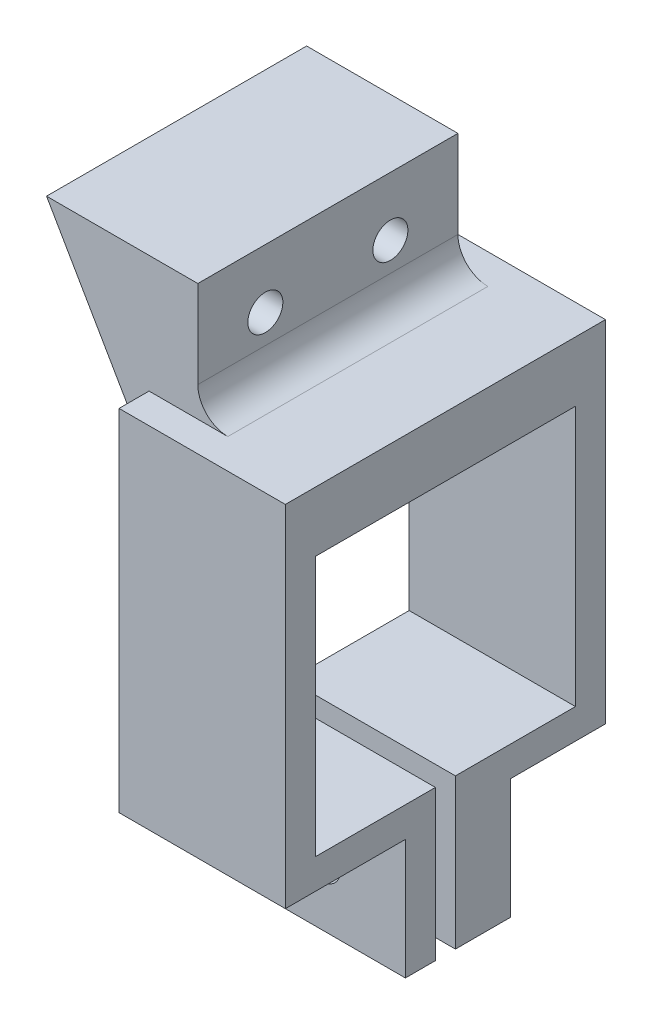
ISO-10303-21;
HEADER;
FILE_DESCRIPTION(('STEP AP214'),'2;1');
FILE_NAME('part.step','',(''),(''),'','','');
FILE_SCHEMA(('AUTOMOTIVE_DESIGN { 1 0 10303 214 1 1 1 1 }'));
ENDSEC;
DATA;
#1=APPLICATION_CONTEXT('core data for automotive mechanical design processes');
#2=APPLICATION_PROTOCOL_DEFINITION('international standard','automotive_design',2000,#1);
#3=PRODUCT_CONTEXT('',#1,'mechanical');
#4=PRODUCT('Part','Part','',(#3));
#5=PRODUCT_RELATED_PRODUCT_CATEGORY('part','',(#4));
#6=PRODUCT_DEFINITION_FORMATION('','',#4);
#7=PRODUCT_DEFINITION_CONTEXT('part definition',#1,'design');
#8=PRODUCT_DEFINITION('design','',#6,#7);
#9=PRODUCT_DEFINITION_SHAPE('','',#8);
#10=(LENGTH_UNIT() NAMED_UNIT(*) SI_UNIT(.MILLI.,.METRE.));
#11=(NAMED_UNIT(*) PLANE_ANGLE_UNIT() SI_UNIT($,.RADIAN.));
#12=(NAMED_UNIT(*) SI_UNIT($,.STERADIAN.) SOLID_ANGLE_UNIT());
#13=UNCERTAINTY_MEASURE_WITH_UNIT(LENGTH_MEASURE(1.E-05),#10,'distance_accuracy_value','');
#14=(GEOMETRIC_REPRESENTATION_CONTEXT(3) GLOBAL_UNCERTAINTY_ASSIGNED_CONTEXT((#13)) GLOBAL_UNIT_ASSIGNED_CONTEXT((#10,
#11,#12)) REPRESENTATION_CONTEXT('',''));
#15=CARTESIAN_POINT('',(0.,0.,0.));
#16=DIRECTION('',(0.,0.,1.));
#17=DIRECTION('',(1.,0.,0.));
#18=AXIS2_PLACEMENT_3D('',#15,#16,#17);
#19=CARTESIAN_POINT('',(0.,0.,0.));
#20=DIRECTION('',(0.,0.,1.));
#21=DIRECTION('',(1.,0.,0.));
#22=AXIS2_PLACEMENT_3D('',#19,#20,#21);
#23=PLANE('',#22);
#24=DIRECTION('',(1.,0.,0.));
#25=VECTOR('',#24,1.);
#26=CARTESIAN_POINT('',(0.,6.,0.));
#27=LINE('',#26,#25);
#28=CARTESIAN_POINT('',(0.,6.,0.));
#29=VERTEX_POINT('',#28);
#30=CARTESIAN_POINT('',(7.87601636094206,6.,0.));
#31=VERTEX_POINT('',#30);
#32=EDGE_CURVE('E328',#29,#31,#27,.T.);
#33=ORIENTED_EDGE('',*,*,#32,.F.);
#34=DIRECTION('',(0.,1.,0.));
#35=VECTOR('',#34,1.);
#36=CARTESIAN_POINT('',(0.,6.,0.));
#37=LINE('',#36,#35);
#38=CARTESIAN_POINT('',(0.,0.,0.));
#39=VERTEX_POINT('',#38);
#40=EDGE_CURVE('E295',#39,#29,#37,.T.);
#41=ORIENTED_EDGE('',*,*,#40,.F.);
#42=DIRECTION('',(0.500000000000001,-0.866025403784438,0.));
#43=VECTOR('',#42,1.);
#44=CARTESIAN_POINT('',(0.,0.,0.));
#45=LINE('',#44,#43);
#46=CARTESIAN_POINT('',(-10.2479672781159,17.75,0.));
#47=VERTEX_POINT('',#46);
#48=EDGE_CURVE('E409',#47,#39,#45,.T.);
#49=ORIENTED_EDGE('',*,*,#48,.F.);
#50=DIRECTION('',(-1.,0.,0.));
#51=VECTOR('',#50,1.);
#52=CARTESIAN_POINT('',(-10.2479672781159,17.75,0.));
#53=LINE('',#52,#51);
#54=CARTESIAN_POINT('',(4.87601636094206,17.75,0.));
#55=VERTEX_POINT('',#54);
#56=EDGE_CURVE('E421',#55,#47,#53,.T.);
#57=ORIENTED_EDGE('',*,*,#56,.F.);
#58=DIRECTION('',(0.,1.,0.));
#59=VECTOR('',#58,1.);
#60=CARTESIAN_POINT('',(4.87601636094206,17.75,0.));
#61=LINE('',#60,#59);
#62=CARTESIAN_POINT('',(4.87601636094206,9.,0.));
#63=VERTEX_POINT('',#62);
#64=EDGE_CURVE('E419',#63,#55,#61,.T.);
#65=ORIENTED_EDGE('',*,*,#64,.F.);
#66=CARTESIAN_POINT('',(7.87601636094206,9.,0.));
#67=DIRECTION('',(0.,0.,1.));
#68=DIRECTION('',(1.,0.,0.));
#69=AXIS2_PLACEMENT_3D('',#66,#67,#68);
#70=CIRCLE('',#69,3.);
#71=EDGE_CURVE('E41',#63,#31,#70,.T.);
#72=ORIENTED_EDGE('',*,*,#71,.T.);
#73=EDGE_LOOP('',(#33,#41,#49,#57,#65,#72));
#74=FACE_BOUND('',#73,.T.);
#75=ADVANCED_FACE('F32',(#74),#23,.F.);
#76=CARTESIAN_POINT('',(16.6260163609421,0.,26.));
#77=DIRECTION('',(0.,1.,0.));
#78=DIRECTION('',(0.,0.,1.));
#79=AXIS2_PLACEMENT_3D('',#76,#77,#78);
#80=PLANE('',#79);
#81=DIRECTION('',(1.,0.,0.));
#82=VECTOR('',#81,1.);
#83=CARTESIAN_POINT('',(16.6260163609421,0.,0.));
#84=LINE('',#83,#82);
#85=CARTESIAN_POINT('',(16.6260163609421,0.,0.));
#86=VERTEX_POINT('',#85);
#87=EDGE_CURVE('E416',#39,#86,#84,.T.);
#88=ORIENTED_EDGE('',*,*,#87,.T.);
#89=DIRECTION('',(0.,0.,-1.));
#90=VECTOR('',#89,1.);
#91=CARTESIAN_POINT('',(16.6260163609421,0.,26.));
#92=LINE('',#91,#90);
#93=CARTESIAN_POINT('',(16.6260163609421,0.,26.));
#94=VERTEX_POINT('',#93);
#95=EDGE_CURVE('E435',#94,#86,#92,.T.);
#96=ORIENTED_EDGE('',*,*,#95,.F.);
#97=DIRECTION('',(1.,0.,0.));
#98=VECTOR('',#97,1.);
#99=CARTESIAN_POINT('',(16.6260163609421,0.,26.));
#100=LINE('',#99,#98);
#101=CARTESIAN_POINT('',(0.,0.,26.));
#102=VERTEX_POINT('',#101);
#103=EDGE_CURVE('E405',#102,#94,#100,.T.);
#104=ORIENTED_EDGE('',*,*,#103,.F.);
#105=DIRECTION('',(0.,0.,-1.));
#106=VECTOR('',#105,1.);
#107=CARTESIAN_POINT('',(0.,0.,26.));
#108=LINE('',#107,#106);
#109=EDGE_CURVE('E415',#102,#39,#108,.T.);
#110=ORIENTED_EDGE('',*,*,#109,.T.);
#111=EDGE_LOOP('',(#88,#96,#104,#110));
#112=FACE_BOUND('',#111,.T.);
#113=ADVANCED_FACE('F476',(#112),#80,.F.);
#114=CARTESIAN_POINT('',(16.6260163609421,6.,26.));
#115=DIRECTION('',(-1.,0.,0.));
#116=DIRECTION('',(0.,0.,1.));
#117=AXIS2_PLACEMENT_3D('',#114,#115,#116);
#118=PLANE('',#117);
#119=ORIENTED_EDGE('',*,*,#95,.T.);
#120=DIRECTION('',(0.,1.,0.));
#121=VECTOR('',#120,1.);
#122=CARTESIAN_POINT('',(16.6260163609421,0.,0.));
#123=LINE('',#122,#121);
#124=CARTESIAN_POINT('',(16.6260163609421,-26.,0.));
#125=VERTEX_POINT('',#124);
#126=EDGE_CURVE('E311',#125,#86,#123,.T.);
#127=ORIENTED_EDGE('',*,*,#126,.F.);
#128=DIRECTION('',(0.,0.,-1.));
#129=VECTOR('',#128,1.);
#130=CARTESIAN_POINT('',(16.6260163609421,-26.,12.));
#131=LINE('',#130,#129);
#132=CARTESIAN_POINT('',(16.6260163609421,-26.,12.));
#133=VERTEX_POINT('',#132);
#134=EDGE_CURVE('E313',#133,#125,#131,.T.);
#135=ORIENTED_EDGE('',*,*,#134,.F.);
#136=DIRECTION('',(0.,1.,0.));
#137=VECTOR('',#136,1.);
#138=CARTESIAN_POINT('',(16.6260163609421,-41.,12.));
#139=LINE('',#138,#137);
#140=CARTESIAN_POINT('',(16.6260163609421,-41.,12.));
#141=VERTEX_POINT('',#140);
#142=EDGE_CURVE('E315',#141,#133,#139,.T.);
#143=ORIENTED_EDGE('',*,*,#142,.F.);
#144=DIRECTION('',(0.,0.,1.));
#145=VECTOR('',#144,1.);
#146=CARTESIAN_POINT('',(16.6260163609421,-41.,9.00000000000001));
#147=LINE('',#146,#145);
#148=CARTESIAN_POINT('',(16.6260163609421,-41.,6.5));
#149=VERTEX_POINT('',#148);
#150=EDGE_CURVE('E291',#149,#141,#147,.T.);
#151=ORIENTED_EDGE('',*,*,#150,.F.);
#152=DIRECTION('',(0.,-1.,0.));
#153=VECTOR('',#152,1.);
#154=CARTESIAN_POINT('',(16.6260163609421,-29.,6.50000000000001));
#155=LINE('',#154,#153);
#156=CARTESIAN_POINT('',(16.6260163609421,-29.,6.50000000000001));
#157=VERTEX_POINT('',#156);
#158=EDGE_CURVE('E269',#157,#149,#155,.T.);
#159=ORIENTED_EDGE('',*,*,#158,.F.);
#160=DIRECTION('',(0.,0.,1.));
#161=VECTOR('',#160,1.);
#162=CARTESIAN_POINT('',(16.6260163609421,-29.,-3.));
#163=LINE('',#162,#161);
#164=CARTESIAN_POINT('',(16.6260163609421,-29.,-3.));
#165=VERTEX_POINT('',#164);
#166=EDGE_CURVE('E286',#165,#157,#163,.T.);
#167=ORIENTED_EDGE('',*,*,#166,.F.);
#168=DIRECTION('',(0.,-1.,0.));
#169=VECTOR('',#168,1.);
#170=CARTESIAN_POINT('',(16.6260163609421,6.,-3.));
#171=LINE('',#170,#169);
#172=CARTESIAN_POINT('',(16.6260163609421,6.,-3.));
#173=VERTEX_POINT('',#172);
#174=EDGE_CURVE('E309',#173,#165,#171,.T.);
#175=ORIENTED_EDGE('',*,*,#174,.F.);
#176=DIRECTION('',(0.,0.,-1.));
#177=VECTOR('',#176,1.);
#178=CARTESIAN_POINT('',(16.6260163609421,6.,26.));
#179=LINE('',#178,#177);
#180=CARTESIAN_POINT('',(16.6260163609421,6.,29.));
#181=VERTEX_POINT('',#180);
#182=EDGE_CURVE('E433',#181,#173,#179,.T.);
#183=ORIENTED_EDGE('',*,*,#182,.F.);
#184=DIRECTION('',(0.,-1.,0.));
#185=VECTOR('',#184,1.);
#186=CARTESIAN_POINT('',(16.6260163609421,6.,29.));
#187=LINE('',#186,#185);
#188=CARTESIAN_POINT('',(16.6260163609421,-29.,29.));
#189=VERTEX_POINT('',#188);
#190=EDGE_CURVE('E339',#181,#189,#187,.T.);
#191=ORIENTED_EDGE('',*,*,#190,.T.);
#192=DIRECTION('',(0.,0.,-1.));
#193=VECTOR('',#192,1.);
#194=CARTESIAN_POINT('',(16.6260163609421,-29.,29.));
#195=LINE('',#194,#193);
#196=CARTESIAN_POINT('',(16.6260163609421,-29.,17.));
#197=VERTEX_POINT('',#196);
#198=EDGE_CURVE('E321',#189,#197,#195,.T.);
#199=ORIENTED_EDGE('',*,*,#198,.T.);
#200=DIRECTION('',(0.,-1.,0.));
#201=VECTOR('',#200,1.);
#202=CARTESIAN_POINT('',(16.6260163609421,-29.,17.));
#203=LINE('',#202,#201);
#204=CARTESIAN_POINT('',(16.6260163609421,-41.,17.));
#205=VERTEX_POINT('',#204);
#206=EDGE_CURVE('E363',#197,#205,#203,.T.);
#207=ORIENTED_EDGE('',*,*,#206,.T.);
#208=DIRECTION('',(0.,0.,-1.));
#209=VECTOR('',#208,1.);
#210=CARTESIAN_POINT('',(16.6260163609421,-41.,17.));
#211=LINE('',#210,#209);
#212=CARTESIAN_POINT('',(16.6260163609421,-41.,14.));
#213=VERTEX_POINT('',#212);
#214=EDGE_CURVE('E366',#205,#213,#211,.T.);
#215=ORIENTED_EDGE('',*,*,#214,.T.);
#216=DIRECTION('',(0.,1.,0.));
#217=VECTOR('',#216,1.);
#218=CARTESIAN_POINT('',(16.6260163609421,-41.,14.));
#219=LINE('',#218,#217);
#220=CARTESIAN_POINT('',(16.6260163609421,-26.,14.));
#221=VERTEX_POINT('',#220);
#222=EDGE_CURVE('E369',#213,#221,#219,.T.);
#223=ORIENTED_EDGE('',*,*,#222,.T.);
#224=DIRECTION('',(0.,0.,1.));
#225=VECTOR('',#224,1.);
#226=CARTESIAN_POINT('',(16.6260163609421,-26.,14.));
#227=LINE('',#226,#225);
#228=CARTESIAN_POINT('',(16.6260163609421,-26.,26.));
#229=VERTEX_POINT('',#228);
#230=EDGE_CURVE('E372',#221,#229,#227,.T.);
#231=ORIENTED_EDGE('',*,*,#230,.T.);
#232=DIRECTION('',(0.,1.,0.));
#233=VECTOR('',#232,1.);
#234=CARTESIAN_POINT('',(16.6260163609421,6.,26.));
#235=LINE('',#234,#233);
#236=EDGE_CURVE('E375',#229,#94,#235,.T.);
#237=ORIENTED_EDGE('',*,*,#236,.T.);
#238=EDGE_LOOP('',(#119,#127,#135,#143,#151,#159,#167,#175,#183,#191,#199,#207,#215,#223,#231,#237));
#239=FACE_BOUND('',#238,.T.);
#240=ADVANCED_FACE('F489',(#239),#118,.F.);
#241=CARTESIAN_POINT('',(4.87601636094206,6.,26.));
#242=DIRECTION('',(0.,-1.,0.));
#243=DIRECTION('',(1.,0.,0.));
#244=AXIS2_PLACEMENT_3D('',#241,#242,#243);
#245=PLANE('',#244);
#246=ORIENTED_EDGE('',*,*,#182,.T.);
#247=DIRECTION('',(1.,0.,0.));
#248=VECTOR('',#247,1.);
#249=CARTESIAN_POINT('',(0.,6.,-3.));
#250=LINE('',#249,#248);
#251=CARTESIAN_POINT('',(0.,6.,-3.));
#252=VERTEX_POINT('',#251);
#253=EDGE_CURVE('E330',#252,#173,#250,.T.);
#254=ORIENTED_EDGE('',*,*,#253,.F.);
#255=DIRECTION('',(0.,0.,-1.));
#256=VECTOR('',#255,1.);
#257=CARTESIAN_POINT('',(0.,6.,0.));
#258=LINE('',#257,#256);
#259=EDGE_CURVE('E293',#29,#252,#258,.T.);
#260=ORIENTED_EDGE('',*,*,#259,.F.);
#261=ORIENTED_EDGE('',*,*,#32,.T.);
#262=DIRECTION('',(0.,0.,-1.));
#263=VECTOR('',#262,1.);
#264=CARTESIAN_POINT('',(7.87601636094206,6.,26.));
#265=LINE('',#264,#263);
#266=CARTESIAN_POINT('',(7.87601636094206,6.,26.));
#267=VERTEX_POINT('',#266);
#268=EDGE_CURVE('E445',#31,#267,#265,.F.);
#269=ORIENTED_EDGE('',*,*,#268,.T.);
#270=DIRECTION('',(1.,0.,0.));
#271=VECTOR('',#270,1.);
#272=CARTESIAN_POINT('',(0.,6.,26.));
#273=LINE('',#272,#271);
#274=CARTESIAN_POINT('',(0.,6.,26.));
#275=VERTEX_POINT('',#274);
#276=EDGE_CURVE('E386',#275,#267,#273,.T.);
#277=ORIENTED_EDGE('',*,*,#276,.F.);
#278=DIRECTION('',(0.,0.,1.));
#279=VECTOR('',#278,1.);
#280=CARTESIAN_POINT('',(0.,6.,26.));
#281=LINE('',#280,#279);
#282=CARTESIAN_POINT('',(0.,6.,29.));
#283=VERTEX_POINT('',#282);
#284=EDGE_CURVE('E354',#275,#283,#281,.T.);
#285=ORIENTED_EDGE('',*,*,#284,.T.);
#286=DIRECTION('',(1.,0.,0.));
#287=VECTOR('',#286,1.);
#288=CARTESIAN_POINT('',(0.,6.,29.));
#289=LINE('',#288,#287);
#290=EDGE_CURVE('E383',#283,#181,#289,.T.);
#291=ORIENTED_EDGE('',*,*,#290,.T.);
#292=EDGE_LOOP('',(#246,#254,#260,#261,#269,#277,#285,#291));
#293=FACE_BOUND('',#292,.T.);
#294=ADVANCED_FACE('F459',(#293),#245,.F.);
#295=CARTESIAN_POINT('',(4.87601636094206,17.75,26.));
#296=DIRECTION('',(-1.,0.,0.));
#297=DIRECTION('',(0.,-1.,0.));
#298=AXIS2_PLACEMENT_3D('',#295,#296,#297);
#299=PLANE('',#298);
#300=CARTESIAN_POINT('',(4.87601636094206,11.875,6.75));
#301=DIRECTION('',(1.,0.,0.));
#302=DIRECTION('',(0.,1.,0.));
#303=AXIS2_PLACEMENT_3D('',#300,#301,#302);
#304=CIRCLE('',#303,1.75);
#305=CARTESIAN_POINT('',(4.87601636094206,13.625,6.75));
#306=VERTEX_POINT('',#305);
#307=EDGE_CURVE('E382',#306,#306,#304,.T.);
#308=ORIENTED_EDGE('',*,*,#307,.F.);
#309=EDGE_LOOP('',(#308));
#310=FACE_BOUND('',#309,.T.);
#311=CARTESIAN_POINT('',(4.87601636094206,11.875,19.25));
#312=DIRECTION('',(1.,0.,0.));
#313=DIRECTION('',(0.,1.,0.));
#314=AXIS2_PLACEMENT_3D('',#311,#312,#313);
#315=CIRCLE('',#314,1.75);
#316=CARTESIAN_POINT('',(4.87601636094206,13.625,19.25));
#317=VERTEX_POINT('',#316);
#318=EDGE_CURVE('E401',#317,#317,#315,.T.);
#319=ORIENTED_EDGE('',*,*,#318,.F.);
#320=EDGE_LOOP('',(#319));
#321=FACE_BOUND('',#320,.T.);
#322=DIRECTION('',(0.,1.,0.));
#323=VECTOR('',#322,1.);
#324=CARTESIAN_POINT('',(4.87601636094206,17.75,26.));
#325=LINE('',#324,#323);
#326=CARTESIAN_POINT('',(4.87601636094206,9.,26.));
#327=VERTEX_POINT('',#326);
#328=CARTESIAN_POINT('',(4.87601636094206,17.75,26.));
#329=VERTEX_POINT('',#328);
#330=EDGE_CURVE('E408',#327,#329,#325,.T.);
#331=ORIENTED_EDGE('',*,*,#330,.F.);
#332=DIRECTION('',(0.,0.,-1.));
#333=VECTOR('',#332,1.);
#334=CARTESIAN_POINT('',(4.87601636094206,9.,0.));
#335=LINE('',#334,#333);
#336=EDGE_CURVE('E438',#327,#63,#335,.T.);
#337=ORIENTED_EDGE('',*,*,#336,.T.);
#338=ORIENTED_EDGE('',*,*,#64,.T.);
#339=DIRECTION('',(0.,0.,-1.));
#340=VECTOR('',#339,1.);
#341=CARTESIAN_POINT('',(4.87601636094206,17.75,26.));
#342=LINE('',#341,#340);
#343=EDGE_CURVE('E430',#329,#55,#342,.T.);
#344=ORIENTED_EDGE('',*,*,#343,.F.);
#345=EDGE_LOOP('',(#331,#337,#338,#344));
#346=FACE_BOUND('',#345,.T.);
#347=ADVANCED_FACE('F560',(#310,#321,#346),#299,.F.);
#348=CARTESIAN_POINT('',(-10.2479672781159,17.75,26.));
#349=DIRECTION('',(0.,-1.,0.));
#350=DIRECTION('',(0.,0.,-1.));
#351=AXIS2_PLACEMENT_3D('',#348,#349,#350);
#352=PLANE('',#351);
#353=ORIENTED_EDGE('',*,*,#56,.T.);
#354=DIRECTION('',(0.,0.,-1.));
#355=VECTOR('',#354,1.);
#356=CARTESIAN_POINT('',(-10.2479672781159,17.75,26.));
#357=LINE('',#356,#355);
#358=CARTESIAN_POINT('',(-10.2479672781159,17.75,26.));
#359=VERTEX_POINT('',#358);
#360=EDGE_CURVE('E427',#359,#47,#357,.T.);
#361=ORIENTED_EDGE('',*,*,#360,.F.);
#362=DIRECTION('',(-1.,0.,0.));
#363=VECTOR('',#362,1.);
#364=CARTESIAN_POINT('',(-10.2479672781159,17.75,26.));
#365=LINE('',#364,#363);
#366=EDGE_CURVE('E411',#329,#359,#365,.T.);
#367=ORIENTED_EDGE('',*,*,#366,.F.);
#368=ORIENTED_EDGE('',*,*,#343,.T.);
#369=EDGE_LOOP('',(#353,#361,#367,#368));
#370=FACE_BOUND('',#369,.T.);
#371=ADVANCED_FACE('F556',(#370),#352,.F.);
#372=CARTESIAN_POINT('',(0.,0.,26.));
#373=DIRECTION('',(0.866025403784438,0.500000000000001,0.));
#374=DIRECTION('',(-0.500000000000001,0.866025403784438,0.));
#375=AXIS2_PLACEMENT_3D('',#372,#373,#374);
#376=PLANE('',#375);
#377=CARTESIAN_POINT('',(-6.85603444662682,11.875,6.75));
#378=DIRECTION('',(0.866025403784438,0.500000000000001,0.));
#379=DIRECTION('',(0.500000000000001,-0.866025403784438,0.));
#380=AXIS2_PLACEMENT_3D('',#377,#378,#379);
#381=ELLIPSE('',#380,2.0207259421637,1.75);
#382=CARTESIAN_POINT('',(-5.84567147554497,10.125,6.75));
#383=VERTEX_POINT('',#382);
#384=EDGE_CURVE('E400',#383,#383,#381,.T.);
#385=ORIENTED_EDGE('',*,*,#384,.T.);
#386=EDGE_LOOP('',(#385));
#387=FACE_BOUND('',#386,.T.);
#388=CARTESIAN_POINT('',(-6.85603444662682,11.875,19.25));
#389=DIRECTION('',(0.866025403784438,0.500000000000001,0.));
#390=DIRECTION('',(0.500000000000001,-0.866025403784438,0.));
#391=AXIS2_PLACEMENT_3D('',#388,#389,#390);
#392=ELLIPSE('',#391,2.02072594216369,1.75);
#393=CARTESIAN_POINT('',(-5.84567147554497,10.125,19.25));
#394=VERTEX_POINT('',#393);
#395=EDGE_CURVE('E404',#394,#394,#392,.T.);
#396=ORIENTED_EDGE('',*,*,#395,.T.);
#397=EDGE_LOOP('',(#396));
#398=FACE_BOUND('',#397,.T.);
#399=ORIENTED_EDGE('',*,*,#48,.T.);
#400=ORIENTED_EDGE('',*,*,#109,.F.);
#401=DIRECTION('',(0.500000000000001,-0.866025403784438,0.));
#402=VECTOR('',#401,1.);
#403=CARTESIAN_POINT('',(0.,0.,26.));
#404=LINE('',#403,#402);
#405=EDGE_CURVE('E413',#359,#102,#404,.T.);
#406=ORIENTED_EDGE('',*,*,#405,.F.);
#407=ORIENTED_EDGE('',*,*,#360,.T.);
#408=EDGE_LOOP('',(#399,#400,#406,#407));
#409=FACE_BOUND('',#408,.T.);
#410=ADVANCED_FACE('F471',(#387,#398,#409),#376,.F.);
#411=CARTESIAN_POINT('',(0.,0.,26.));
#412=DIRECTION('',(0.,0.,1.));
#413=DIRECTION('',(1.,0.,0.));
#414=AXIS2_PLACEMENT_3D('',#411,#412,#413);
#415=PLANE('',#414);
#416=ORIENTED_EDGE('',*,*,#276,.T.);
#417=CARTESIAN_POINT('',(7.87601636094206,9.,26.));
#418=DIRECTION('',(0.,0.,1.));
#419=DIRECTION('',(1.,0.,0.));
#420=AXIS2_PLACEMENT_3D('',#417,#418,#419);
#421=CIRCLE('',#420,3.);
#422=EDGE_CURVE('E11',#267,#327,#421,.F.);
#423=ORIENTED_EDGE('',*,*,#422,.T.);
#424=ORIENTED_EDGE('',*,*,#330,.T.);
#425=ORIENTED_EDGE('',*,*,#366,.T.);
#426=ORIENTED_EDGE('',*,*,#405,.T.);
#427=DIRECTION('',(0.,1.,0.));
#428=VECTOR('',#427,1.);
#429=CARTESIAN_POINT('',(0.,0.,26.));
#430=LINE('',#429,#428);
#431=EDGE_CURVE('E56',#102,#275,#430,.T.);
#432=ORIENTED_EDGE('',*,*,#431,.T.);
#433=EDGE_LOOP('',(#416,#423,#424,#425,#426,#432));
#434=FACE_BOUND('',#433,.T.);
#435=ADVANCED_FACE('F552',(#434),#415,.T.);
#436=CARTESIAN_POINT('',(-10.2479672781159,11.875,19.25));
#437=DIRECTION('',(1.,0.,0.));
#438=DIRECTION('',(0.,0.,-1.));
#439=AXIS2_PLACEMENT_3D('',#436,#437,#438);
#440=CYLINDRICAL_SURFACE('',#439,1.75);
#441=ORIENTED_EDGE('',*,*,#318,.T.);
#442=EDGE_LOOP('',(#441));
#443=FACE_BOUND('',#442,.T.);
#444=ORIENTED_EDGE('',*,*,#395,.F.);
#445=EDGE_LOOP('',(#444));
#446=FACE_BOUND('',#445,.T.);
#447=ADVANCED_FACE('F599',(#443,#446),#440,.F.);
#448=CARTESIAN_POINT('',(-10.2479672781159,11.875,6.75));
#449=DIRECTION('',(1.,0.,0.));
#450=DIRECTION('',(0.,0.,-1.));
#451=AXIS2_PLACEMENT_3D('',#448,#449,#450);
#452=CYLINDRICAL_SURFACE('',#451,1.75);
#453=ORIENTED_EDGE('',*,*,#307,.T.);
#454=EDGE_LOOP('',(#453));
#455=FACE_BOUND('',#454,.T.);
#456=ORIENTED_EDGE('',*,*,#384,.F.);
#457=EDGE_LOOP('',(#456));
#458=FACE_BOUND('',#457,.T.);
#459=ADVANCED_FACE('F605',(#455,#458),#452,.F.);
#460=CARTESIAN_POINT('',(7.87601636094206,9.,26.));
#461=DIRECTION('',(0.,0.,1.));
#462=DIRECTION('',(1.,0.,0.));
#463=AXIS2_PLACEMENT_3D('',#460,#461,#462);
#464=CYLINDRICAL_SURFACE('',#463,3.);
#465=ORIENTED_EDGE('',*,*,#422,.F.);
#466=ORIENTED_EDGE('',*,*,#268,.F.);
#467=ORIENTED_EDGE('',*,*,#71,.F.);
#468=ORIENTED_EDGE('',*,*,#336,.F.);
#469=EDGE_LOOP('',(#465,#466,#467,#468));
#470=FACE_BOUND('',#469,.T.);
#471=ADVANCED_FACE('F34',(#470),#464,.F.);
#472=CARTESIAN_POINT('',(0.,6.,26.));
#473=DIRECTION('',(0.,0.,-1.));
#474=DIRECTION('',(-1.,0.,0.));
#475=AXIS2_PLACEMENT_3D('',#472,#473,#474);
#476=PLANE('',#475);
#477=ORIENTED_EDGE('',*,*,#103,.T.);
#478=ORIENTED_EDGE('',*,*,#236,.F.);
#479=DIRECTION('',(1.,0.,0.));
#480=VECTOR('',#479,1.);
#481=CARTESIAN_POINT('',(0.,-26.,26.));
#482=LINE('',#481,#480);
#483=CARTESIAN_POINT('',(0.,-26.,26.));
#484=VERTEX_POINT('',#483);
#485=EDGE_CURVE('E388',#484,#229,#482,.T.);
#486=ORIENTED_EDGE('',*,*,#485,.F.);
#487=EDGE_CURVE('E351',#484,#102,#430,.T.);
#488=ORIENTED_EDGE('',*,*,#487,.T.);
#489=EDGE_LOOP('',(#477,#478,#486,#488));
#490=FACE_BOUND('',#489,.T.);
#491=ADVANCED_FACE('F484',(#490),#476,.T.);
#492=CARTESIAN_POINT('',(0.,-29.,29.));
#493=DIRECTION('',(0.,-1.,0.));
#494=DIRECTION('',(0.,0.,-1.));
#495=AXIS2_PLACEMENT_3D('',#492,#493,#494);
#496=PLANE('',#495);
#497=ORIENTED_EDGE('',*,*,#198,.F.);
#498=DIRECTION('',(1.,0.,0.));
#499=VECTOR('',#498,1.);
#500=CARTESIAN_POINT('',(0.,-29.,29.));
#501=LINE('',#500,#499);
#502=CARTESIAN_POINT('',(0.,-29.,29.));
#503=VERTEX_POINT('',#502);
#504=EDGE_CURVE('E380',#503,#189,#501,.T.);
#505=ORIENTED_EDGE('',*,*,#504,.F.);
#506=DIRECTION('',(0.,0.,-1.));
#507=VECTOR('',#506,1.);
#508=CARTESIAN_POINT('',(0.,-29.,29.));
#509=LINE('',#508,#507);
#510=CARTESIAN_POINT('',(0.,-29.,17.));
#511=VERTEX_POINT('',#510);
#512=EDGE_CURVE('E335',#503,#511,#509,.T.);
#513=ORIENTED_EDGE('',*,*,#512,.T.);
#514=DIRECTION('',(1.,0.,0.));
#515=VECTOR('',#514,1.);
#516=CARTESIAN_POINT('',(0.,-29.,17.));
#517=LINE('',#516,#515);
#518=EDGE_CURVE('E360',#511,#197,#517,.T.);
#519=ORIENTED_EDGE('',*,*,#518,.T.);
#520=EDGE_LOOP('',(#497,#505,#513,#519));
#521=FACE_BOUND('',#520,.T.);
#522=ADVANCED_FACE('F504',(#521),#496,.T.);
#523=CARTESIAN_POINT('',(0.,6.,29.));
#524=DIRECTION('',(0.,0.,1.));
#525=DIRECTION('',(0.,-1.,0.));
#526=AXIS2_PLACEMENT_3D('',#523,#524,#525);
#527=PLANE('',#526);
#528=ORIENTED_EDGE('',*,*,#190,.F.);
#529=ORIENTED_EDGE('',*,*,#290,.F.);
#530=DIRECTION('',(0.,-1.,0.));
#531=VECTOR('',#530,1.);
#532=CARTESIAN_POINT('',(0.,6.,29.));
#533=LINE('',#532,#531);
#534=EDGE_CURVE('E357',#283,#503,#533,.T.);
#535=ORIENTED_EDGE('',*,*,#534,.T.);
#536=ORIENTED_EDGE('',*,*,#504,.T.);
#537=EDGE_LOOP('',(#528,#529,#535,#536));
#538=FACE_BOUND('',#537,.T.);
#539=ADVANCED_FACE('F507',(#538),#527,.T.);
#540=CARTESIAN_POINT('',(0.,-26.,14.));
#541=DIRECTION('',(0.,1.,0.));
#542=DIRECTION('',(0.,0.,1.));
#543=AXIS2_PLACEMENT_3D('',#540,#541,#542);
#544=PLANE('',#543);
#545=ORIENTED_EDGE('',*,*,#230,.F.);
#546=DIRECTION('',(1.,0.,0.));
#547=VECTOR('',#546,1.);
#548=CARTESIAN_POINT('',(0.,-26.,14.));
#549=LINE('',#548,#547);
#550=CARTESIAN_POINT('',(0.,-26.,14.));
#551=VERTEX_POINT('',#550);
#552=EDGE_CURVE('E391',#551,#221,#549,.T.);
#553=ORIENTED_EDGE('',*,*,#552,.F.);
#554=DIRECTION('',(0.,0.,1.));
#555=VECTOR('',#554,1.);
#556=CARTESIAN_POINT('',(0.,-26.,14.));
#557=LINE('',#556,#555);
#558=EDGE_CURVE('E348',#551,#484,#557,.T.);
#559=ORIENTED_EDGE('',*,*,#558,.T.);
#560=ORIENTED_EDGE('',*,*,#485,.T.);
#561=EDGE_LOOP('',(#545,#553,#559,#560));
#562=FACE_BOUND('',#561,.T.);
#563=ADVANCED_FACE('F487',(#562),#544,.T.);
#564=CARTESIAN_POINT('',(0.,-41.,14.));
#565=DIRECTION('',(0.,0.,-1.));
#566=DIRECTION('',(-1.,0.,0.));
#567=AXIS2_PLACEMENT_3D('',#564,#565,#566);
#568=PLANE('',#567);
#569=CARTESIAN_POINT('',(8.31300818047103,-35.,14.));
#570=DIRECTION('',(0.,0.,-1.));
#571=DIRECTION('',(-1.,0.,0.));
#572=AXIS2_PLACEMENT_3D('',#569,#570,#571);
#573=CIRCLE('',#572,1.8);
#574=CARTESIAN_POINT('',(6.51300818047103,-35.,14.));
#575=VERTEX_POINT('',#574);
#576=EDGE_CURVE('E283',#575,#575,#573,.T.);
#577=ORIENTED_EDGE('',*,*,#576,.F.);
#578=EDGE_LOOP('',(#577));
#579=FACE_BOUND('',#578,.T.);
#580=ORIENTED_EDGE('',*,*,#222,.F.);
#581=DIRECTION('',(1.,0.,0.));
#582=VECTOR('',#581,1.);
#583=CARTESIAN_POINT('',(0.,-41.,14.));
#584=LINE('',#583,#582);
#585=CARTESIAN_POINT('',(0.,-41.,14.));
#586=VERTEX_POINT('',#585);
#587=EDGE_CURVE('E393',#586,#213,#584,.T.);
#588=ORIENTED_EDGE('',*,*,#587,.F.);
#589=DIRECTION('',(0.,1.,0.));
#590=VECTOR('',#589,1.);
#591=CARTESIAN_POINT('',(0.,-41.,14.));
#592=LINE('',#591,#590);
#593=EDGE_CURVE('E345',#586,#551,#592,.T.);
#594=ORIENTED_EDGE('',*,*,#593,.T.);
#595=ORIENTED_EDGE('',*,*,#552,.T.);
#596=EDGE_LOOP('',(#580,#588,#594,#595));
#597=FACE_BOUND('',#596,.T.);
#598=ADVANCED_FACE('F493',(#579,#597),#568,.T.);
#599=CARTESIAN_POINT('',(0.,-41.,17.));
#600=DIRECTION('',(0.,-1.,0.));
#601=DIRECTION('',(0.,0.,-1.));
#602=AXIS2_PLACEMENT_3D('',#599,#600,#601);
#603=PLANE('',#602);
#604=ORIENTED_EDGE('',*,*,#214,.F.);
#605=DIRECTION('',(1.,0.,0.));
#606=VECTOR('',#605,1.);
#607=CARTESIAN_POINT('',(0.,-41.,17.));
#608=LINE('',#607,#606);
#609=CARTESIAN_POINT('',(0.,-41.,17.));
#610=VERTEX_POINT('',#609);
#611=EDGE_CURVE('E395',#610,#205,#608,.T.);
#612=ORIENTED_EDGE('',*,*,#611,.F.);
#613=DIRECTION('',(0.,0.,-1.));
#614=VECTOR('',#613,1.);
#615=CARTESIAN_POINT('',(0.,-41.,17.));
#616=LINE('',#615,#614);
#617=EDGE_CURVE('E342',#610,#586,#616,.T.);
#618=ORIENTED_EDGE('',*,*,#617,.T.);
#619=ORIENTED_EDGE('',*,*,#587,.T.);
#620=EDGE_LOOP('',(#604,#612,#618,#619));
#621=FACE_BOUND('',#620,.T.);
#622=ADVANCED_FACE('F498',(#621),#603,.T.);
#623=CARTESIAN_POINT('',(0.,-29.,17.));
#624=DIRECTION('',(0.,0.,1.));
#625=DIRECTION('',(0.,-1.,0.));
#626=AXIS2_PLACEMENT_3D('',#623,#624,#625);
#627=PLANE('',#626);
#628=CARTESIAN_POINT('',(8.31300818047103,-35.,17.));
#629=DIRECTION('',(0.,0.,1.));
#630=DIRECTION('',(1.,0.,0.));
#631=AXIS2_PLACEMENT_3D('',#628,#629,#630);
#632=CIRCLE('',#631,1.8);
#633=CARTESIAN_POINT('',(10.113008180471,-35.,17.));
#634=VERTEX_POINT('',#633);
#635=EDGE_CURVE('E277',#634,#634,#632,.T.);
#636=ORIENTED_EDGE('',*,*,#635,.F.);
#637=EDGE_LOOP('',(#636));
#638=FACE_BOUND('',#637,.T.);
#639=ORIENTED_EDGE('',*,*,#206,.F.);
#640=ORIENTED_EDGE('',*,*,#518,.F.);
#641=DIRECTION('',(0.,-1.,0.));
#642=VECTOR('',#641,1.);
#643=CARTESIAN_POINT('',(0.,-29.,17.));
#644=LINE('',#643,#642);
#645=EDGE_CURVE('E338',#511,#610,#644,.T.);
#646=ORIENTED_EDGE('',*,*,#645,.T.);
#647=ORIENTED_EDGE('',*,*,#611,.T.);
#648=EDGE_LOOP('',(#639,#640,#646,#647));
#649=FACE_BOUND('',#648,.T.);
#650=ADVANCED_FACE('F501',(#638,#649),#627,.T.);
#651=CARTESIAN_POINT('',(0.,0.,0.));
#652=DIRECTION('',(-1.,0.,0.));
#653=DIRECTION('',(0.,0.,1.));
#654=AXIS2_PLACEMENT_3D('',#651,#652,#653);
#655=PLANE('',#654);
#656=ORIENTED_EDGE('',*,*,#512,.F.);
#657=ORIENTED_EDGE('',*,*,#534,.F.);
#658=ORIENTED_EDGE('',*,*,#284,.F.);
#659=ORIENTED_EDGE('',*,*,#431,.F.);
#660=ORIENTED_EDGE('',*,*,#487,.F.);
#661=ORIENTED_EDGE('',*,*,#558,.F.);
#662=ORIENTED_EDGE('',*,*,#593,.F.);
#663=ORIENTED_EDGE('',*,*,#617,.F.);
#664=ORIENTED_EDGE('',*,*,#645,.F.);
#665=EDGE_LOOP('',(#656,#657,#658,#659,#660,#661,#662,#663,#664));
#666=FACE_BOUND('',#665,.T.);
#667=ADVANCED_FACE('F481',(#666),#655,.T.);
#668=CARTESIAN_POINT('',(0.,0.,0.));
#669=DIRECTION('',(0.,0.,-1.));
#670=DIRECTION('',(-1.,0.,0.));
#671=AXIS2_PLACEMENT_3D('',#668,#669,#670);
#672=PLANE('',#671);
#673=ORIENTED_EDGE('',*,*,#126,.T.);
#674=ORIENTED_EDGE('',*,*,#87,.F.);
#675=CARTESIAN_POINT('',(0.,-26.,0.));
#676=VERTEX_POINT('',#675);
#677=EDGE_CURVE('E296',#676,#39,#37,.T.);
#678=ORIENTED_EDGE('',*,*,#677,.F.);
#679=DIRECTION('',(1.,0.,0.));
#680=VECTOR('',#679,1.);
#681=CARTESIAN_POINT('',(0.,-26.,0.));
#682=LINE('',#681,#680);
#683=EDGE_CURVE('E325',#676,#125,#682,.T.);
#684=ORIENTED_EDGE('',*,*,#683,.T.);
#685=EDGE_LOOP('',(#673,#674,#678,#684));
#686=FACE_BOUND('',#685,.T.);
#687=ADVANCED_FACE('F533',(#686),#672,.F.);
#688=CARTESIAN_POINT('',(0.,-29.,-3.));
#689=DIRECTION('',(0.,1.,0.));
#690=DIRECTION('',(0.,0.,1.));
#691=AXIS2_PLACEMENT_3D('',#688,#689,#690);
#692=PLANE('',#691);
#693=ORIENTED_EDGE('',*,*,#166,.T.);
#694=DIRECTION('',(1.,0.,0.));
#695=VECTOR('',#694,1.);
#696=CARTESIAN_POINT('',(0.,-29.,6.50000000000001));
#697=LINE('',#696,#695);
#698=CARTESIAN_POINT('',(0.,-29.,6.50000000000001));
#699=VERTEX_POINT('',#698);
#700=EDGE_CURVE('E228',#699,#157,#697,.T.);
#701=ORIENTED_EDGE('',*,*,#700,.F.);
#702=DIRECTION('',(0.,0.,1.));
#703=VECTOR('',#702,1.);
#704=CARTESIAN_POINT('',(0.,-29.,-3.));
#705=LINE('',#704,#703);
#706=CARTESIAN_POINT('',(0.,-29.,-3.));
#707=VERTEX_POINT('',#706);
#708=EDGE_CURVE('E287',#707,#699,#705,.T.);
#709=ORIENTED_EDGE('',*,*,#708,.F.);
#710=DIRECTION('',(1.,0.,0.));
#711=VECTOR('',#710,1.);
#712=CARTESIAN_POINT('',(0.,-29.,-3.));
#713=LINE('',#712,#711);
#714=EDGE_CURVE('E306',#707,#165,#713,.T.);
#715=ORIENTED_EDGE('',*,*,#714,.T.);
#716=EDGE_LOOP('',(#693,#701,#709,#715));
#717=FACE_BOUND('',#716,.T.);
#718=ADVANCED_FACE('F514',(#717),#692,.F.);
#719=CARTESIAN_POINT('',(0.,-29.,9.00000000000001));
#720=DIRECTION('',(0.,0.,1.));
#721=DIRECTION('',(0.,-1.,0.));
#722=AXIS2_PLACEMENT_3D('',#719,#720,#721);
#723=PLANE('',#722);
#724=DIRECTION('',(-0.866025403784438,0.5,0.));
#725=VECTOR('',#724,1.);
#726=CARTESIAN_POINT('',(8.31300818047105,-38.2331615074619,9.00000000000001));
#727=LINE('',#726,#725);
#728=CARTESIAN_POINT('',(8.31300818047105,-38.2331615074619,9.00000000000001));
#729=VERTEX_POINT('',#728);
#730=CARTESIAN_POINT('',(5.51300818047104,-36.6165807537309,9.00000000000001));
#731=VERTEX_POINT('',#730);
#732=EDGE_CURVE('E221',#729,#731,#727,.T.);
#733=ORIENTED_EDGE('',*,*,#732,.T.);
#734=DIRECTION('',(0.,1.,0.));
#735=VECTOR('',#734,1.);
#736=CARTESIAN_POINT('',(5.51300818047104,-36.6165807537309,9.00000000000001));
#737=LINE('',#736,#735);
#738=CARTESIAN_POINT('',(5.51300818047104,-33.383419246269,9.00000000000001));
#739=VERTEX_POINT('',#738);
#740=EDGE_CURVE('E245',#731,#739,#737,.T.);
#741=ORIENTED_EDGE('',*,*,#740,.T.);
#742=DIRECTION('',(0.866025403784438,0.5,0.));
#743=VECTOR('',#742,1.);
#744=CARTESIAN_POINT('',(5.51300818047104,-33.383419246269,9.00000000000001));
#745=LINE('',#744,#743);
#746=CARTESIAN_POINT('',(8.31300818047104,-31.7668384925381,9.00000000000001));
#747=VERTEX_POINT('',#746);
#748=EDGE_CURVE('E227',#739,#747,#745,.T.);
#749=ORIENTED_EDGE('',*,*,#748,.T.);
#750=DIRECTION('',(0.866025403784439,-0.5,0.));
#751=VECTOR('',#750,1.);
#752=CARTESIAN_POINT('',(8.31300818047104,-31.7668384925381,9.00000000000001));
#753=LINE('',#752,#751);
#754=CARTESIAN_POINT('',(11.113008180471,-33.383419246269,9.00000000000001));
#755=VERTEX_POINT('',#754);
#756=EDGE_CURVE('E248',#747,#755,#753,.T.);
#757=ORIENTED_EDGE('',*,*,#756,.T.);
#758=DIRECTION('',(0.,-1.,0.));
#759=VECTOR('',#758,1.);
#760=CARTESIAN_POINT('',(11.113008180471,-33.383419246269,9.00000000000001));
#761=LINE('',#760,#759);
#762=CARTESIAN_POINT('',(11.113008180471,-36.6165807537309,9.00000000000001));
#763=VERTEX_POINT('',#762);
#764=EDGE_CURVE('E251',#755,#763,#761,.T.);
#765=ORIENTED_EDGE('',*,*,#764,.T.);
#766=DIRECTION('',(-0.866025403784438,-0.500000000000001,0.));
#767=VECTOR('',#766,1.);
#768=CARTESIAN_POINT('',(11.113008180471,-36.6165807537309,9.00000000000001));
#769=LINE('',#768,#767);
#770=EDGE_CURVE('E254',#763,#729,#769,.T.);
#771=ORIENTED_EDGE('',*,*,#770,.T.);
#772=EDGE_LOOP('',(#733,#741,#749,#757,#765,#771));
#773=FACE_BOUND('',#772,.T.);
#774=CARTESIAN_POINT('',(8.31300818047103,-35.,9.00000000000001));
#775=DIRECTION('',(0.,0.,1.));
#776=DIRECTION('',(0.,-1.,0.));
#777=AXIS2_PLACEMENT_3D('',#774,#775,#776);
#778=CIRCLE('',#777,1.8);
#779=CARTESIAN_POINT('',(8.31300818047103,-36.8,9.00000000000001));
#780=VERTEX_POINT('',#779);
#781=EDGE_CURVE('E280',#780,#780,#778,.T.);
#782=ORIENTED_EDGE('',*,*,#781,.T.);
#783=EDGE_LOOP('',(#782));
#784=FACE_BOUND('',#783,.T.);
#785=ADVANCED_FACE('F540',(#773,#784),#723,.F.);
#786=CARTESIAN_POINT('',(0.,-41.,9.00000000000001));
#787=DIRECTION('',(0.,1.,0.));
#788=DIRECTION('',(0.,0.,1.));
#789=AXIS2_PLACEMENT_3D('',#786,#787,#788);
#790=PLANE('',#789);
#791=ORIENTED_EDGE('',*,*,#150,.T.);
#792=DIRECTION('',(1.,0.,0.));
#793=VECTOR('',#792,1.);
#794=CARTESIAN_POINT('',(0.,-41.,12.));
#795=LINE('',#794,#793);
#796=CARTESIAN_POINT('',(0.,-41.,12.));
#797=VERTEX_POINT('',#796);
#798=EDGE_CURVE('E318',#797,#141,#795,.T.);
#799=ORIENTED_EDGE('',*,*,#798,.F.);
#800=DIRECTION('',(0.,0.,1.));
#801=VECTOR('',#800,1.);
#802=CARTESIAN_POINT('',(0.,-41.,9.00000000000001));
#803=LINE('',#802,#801);
#804=CARTESIAN_POINT('',(0.,-41.,6.5));
#805=VERTEX_POINT('',#804);
#806=EDGE_CURVE('E304',#805,#797,#803,.T.);
#807=ORIENTED_EDGE('',*,*,#806,.F.);
#808=DIRECTION('',(-1.,0.,0.));
#809=VECTOR('',#808,1.);
#810=CARTESIAN_POINT('',(16.6260163609421,-41.,6.5));
#811=LINE('',#810,#809);
#812=EDGE_CURVE('E272',#149,#805,#811,.T.);
#813=ORIENTED_EDGE('',*,*,#812,.F.);
#814=EDGE_LOOP('',(#791,#799,#807,#813));
#815=FACE_BOUND('',#814,.T.);
#816=ADVANCED_FACE('F520',(#815),#790,.F.);
#817=CARTESIAN_POINT('',(0.,-41.,12.));
#818=DIRECTION('',(0.,0.,-1.));
#819=DIRECTION('',(-1.,0.,0.));
#820=AXIS2_PLACEMENT_3D('',#817,#818,#819);
#821=PLANE('',#820);
#822=CARTESIAN_POINT('',(8.31300818047103,-35.,12.));
#823=DIRECTION('',(0.,0.,-1.));
#824=DIRECTION('',(-1.,0.,0.));
#825=AXIS2_PLACEMENT_3D('',#822,#823,#824);
#826=CIRCLE('',#825,1.8);
#827=CARTESIAN_POINT('',(6.51300818047103,-35.,12.));
#828=VERTEX_POINT('',#827);
#829=EDGE_CURVE('E36',#828,#828,#826,.T.);
#830=ORIENTED_EDGE('',*,*,#829,.T.);
#831=EDGE_LOOP('',(#830));
#832=FACE_BOUND('',#831,.T.);
#833=ORIENTED_EDGE('',*,*,#142,.T.);
#834=DIRECTION('',(1.,0.,0.));
#835=VECTOR('',#834,1.);
#836=CARTESIAN_POINT('',(0.,-26.,12.));
#837=LINE('',#836,#835);
#838=CARTESIAN_POINT('',(0.,-26.,12.));
#839=VERTEX_POINT('',#838);
#840=EDGE_CURVE('E322',#839,#133,#837,.T.);
#841=ORIENTED_EDGE('',*,*,#840,.F.);
#842=DIRECTION('',(0.,1.,0.));
#843=VECTOR('',#842,1.);
#844=CARTESIAN_POINT('',(0.,-41.,12.));
#845=LINE('',#844,#843);
#846=EDGE_CURVE('E302',#797,#839,#845,.T.);
#847=ORIENTED_EDGE('',*,*,#846,.F.);
#848=ORIENTED_EDGE('',*,*,#798,.T.);
#849=EDGE_LOOP('',(#833,#841,#847,#848));
#850=FACE_BOUND('',#849,.T.);
#851=ADVANCED_FACE('F525',(#832,#850),#821,.F.);
#852=CARTESIAN_POINT('',(0.,-26.,12.));
#853=DIRECTION('',(0.,-1.,0.));
#854=DIRECTION('',(0.,0.,-1.));
#855=AXIS2_PLACEMENT_3D('',#852,#853,#854);
#856=PLANE('',#855);
#857=ORIENTED_EDGE('',*,*,#134,.T.);
#858=ORIENTED_EDGE('',*,*,#683,.F.);
#859=DIRECTION('',(0.,0.,-1.));
#860=VECTOR('',#859,1.);
#861=CARTESIAN_POINT('',(0.,-26.,12.));
#862=LINE('',#861,#860);
#863=EDGE_CURVE('E299',#839,#676,#862,.T.);
#864=ORIENTED_EDGE('',*,*,#863,.F.);
#865=ORIENTED_EDGE('',*,*,#840,.T.);
#866=EDGE_LOOP('',(#857,#858,#864,#865));
#867=FACE_BOUND('',#866,.T.);
#868=ADVANCED_FACE('F529',(#867),#856,.F.);
#869=CARTESIAN_POINT('',(0.,6.,-3.));
#870=DIRECTION('',(0.,0.,1.));
#871=DIRECTION('',(0.,-1.,0.));
#872=AXIS2_PLACEMENT_3D('',#869,#870,#871);
#873=PLANE('',#872);
#874=ORIENTED_EDGE('',*,*,#174,.T.);
#875=ORIENTED_EDGE('',*,*,#714,.F.);
#876=DIRECTION('',(0.,-1.,0.));
#877=VECTOR('',#876,1.);
#878=CARTESIAN_POINT('',(0.,6.,-3.));
#879=LINE('',#878,#877);
#880=EDGE_CURVE('E290',#252,#707,#879,.T.);
#881=ORIENTED_EDGE('',*,*,#880,.F.);
#882=ORIENTED_EDGE('',*,*,#253,.T.);
#883=EDGE_LOOP('',(#874,#875,#881,#882));
#884=FACE_BOUND('',#883,.T.);
#885=ADVANCED_FACE('F510',(#884),#873,.F.);
#886=CARTESIAN_POINT('',(0.,0.,26.));
#887=DIRECTION('',(-1.,0.,0.));
#888=DIRECTION('',(0.,0.,-1.));
#889=AXIS2_PLACEMENT_3D('',#886,#887,#888);
#890=PLANE('',#889);
#891=DIRECTION('',(0.,1.,0.));
#892=VECTOR('',#891,1.);
#893=CARTESIAN_POINT('',(0.,-41.,6.5));
#894=LINE('',#893,#892);
#895=EDGE_CURVE('E275',#805,#699,#894,.T.);
#896=ORIENTED_EDGE('',*,*,#895,.F.);
#897=ORIENTED_EDGE('',*,*,#806,.T.);
#898=ORIENTED_EDGE('',*,*,#846,.T.);
#899=ORIENTED_EDGE('',*,*,#863,.T.);
#900=ORIENTED_EDGE('',*,*,#677,.T.);
#901=ORIENTED_EDGE('',*,*,#40,.T.);
#902=ORIENTED_EDGE('',*,*,#259,.T.);
#903=ORIENTED_EDGE('',*,*,#880,.T.);
#904=ORIENTED_EDGE('',*,*,#708,.T.);
#905=EDGE_LOOP('',(#896,#897,#898,#899,#900,#901,#902,#903,#904));
#906=FACE_BOUND('',#905,.T.);
#907=ADVANCED_FACE('F466',(#906),#890,.T.);
#908=CARTESIAN_POINT('',(8.31300818047103,-35.,-3.));
#909=DIRECTION('',(0.,0.,1.));
#910=DIRECTION('',(1.,0.,0.));
#911=AXIS2_PLACEMENT_3D('',#908,#909,#910);
#912=CYLINDRICAL_SURFACE('',#911,1.8);
#913=ORIENTED_EDGE('',*,*,#829,.F.);
#914=EDGE_LOOP('',(#913));
#915=FACE_BOUND('',#914,.T.);
#916=ORIENTED_EDGE('',*,*,#781,.F.);
#917=EDGE_LOOP('',(#916));
#918=FACE_BOUND('',#917,.T.);
#919=ADVANCED_FACE('F778',(#915,#918),#912,.F.);
#920=ORIENTED_EDGE('',*,*,#576,.T.);
#921=EDGE_LOOP('',(#920));
#922=FACE_BOUND('',#921,.T.);
#923=ORIENTED_EDGE('',*,*,#635,.T.);
#924=EDGE_LOOP('',(#923));
#925=FACE_BOUND('',#924,.T.);
#926=ADVANCED_FACE('F788',(#922,#925),#912,.F.);
#927=CARTESIAN_POINT('',(0.,0.,6.50000000000002));
#928=DIRECTION('',(0.,0.,-1.));
#929=DIRECTION('',(0.,1.,0.));
#930=AXIS2_PLACEMENT_3D('',#927,#928,#929);
#931=PLANE('',#930);
#932=ORIENTED_EDGE('',*,*,#700,.T.);
#933=ORIENTED_EDGE('',*,*,#158,.T.);
#934=ORIENTED_EDGE('',*,*,#812,.T.);
#935=ORIENTED_EDGE('',*,*,#895,.T.);
#936=EDGE_LOOP('',(#932,#933,#934,#935));
#937=FACE_BOUND('',#936,.T.);
#938=DIRECTION('',(0.866025403784438,0.5,0.));
#939=VECTOR('',#938,1.);
#940=CARTESIAN_POINT('',(5.51300818047104,-33.383419246269,6.50000000000001));
#941=LINE('',#940,#939);
#942=CARTESIAN_POINT('',(5.51300818047104,-33.383419246269,6.50000000000001));
#943=VERTEX_POINT('',#942);
#944=CARTESIAN_POINT('',(8.31300818047104,-31.7668384925381,6.50000000000001));
#945=VERTEX_POINT('',#944);
#946=EDGE_CURVE('E220',#943,#945,#941,.T.);
#947=ORIENTED_EDGE('',*,*,#946,.F.);
#948=DIRECTION('',(0.,1.,0.));
#949=VECTOR('',#948,1.);
#950=CARTESIAN_POINT('',(5.51300818047104,-36.6165807537309,6.50000000000001));
#951=LINE('',#950,#949);
#952=CARTESIAN_POINT('',(5.51300818047104,-36.6165807537309,6.50000000000001));
#953=VERTEX_POINT('',#952);
#954=EDGE_CURVE('E212',#953,#943,#951,.T.);
#955=ORIENTED_EDGE('',*,*,#954,.F.);
#956=DIRECTION('',(-0.866025403784438,0.5,0.));
#957=VECTOR('',#956,1.);
#958=CARTESIAN_POINT('',(8.31300818047105,-38.2331615074619,6.50000000000001));
#959=LINE('',#958,#957);
#960=CARTESIAN_POINT('',(8.31300818047104,-38.2331615074619,6.50000000000001));
#961=VERTEX_POINT('',#960);
#962=EDGE_CURVE('E243',#961,#953,#959,.T.);
#963=ORIENTED_EDGE('',*,*,#962,.F.);
#964=DIRECTION('',(-0.866025403784438,-0.500000000000001,0.));
#965=VECTOR('',#964,1.);
#966=CARTESIAN_POINT('',(11.113008180471,-36.6165807537309,6.50000000000001));
#967=LINE('',#966,#965);
#968=CARTESIAN_POINT('',(11.113008180471,-36.6165807537309,6.50000000000001));
#969=VERTEX_POINT('',#968);
#970=EDGE_CURVE('E240',#969,#961,#967,.T.);
#971=ORIENTED_EDGE('',*,*,#970,.F.);
#972=DIRECTION('',(0.,-1.,0.));
#973=VECTOR('',#972,1.);
#974=CARTESIAN_POINT('',(11.113008180471,-33.383419246269,6.50000000000001));
#975=LINE('',#974,#973);
#976=CARTESIAN_POINT('',(11.113008180471,-33.383419246269,6.50000000000001));
#977=VERTEX_POINT('',#976);
#978=EDGE_CURVE('E236',#977,#969,#975,.T.);
#979=ORIENTED_EDGE('',*,*,#978,.F.);
#980=DIRECTION('',(0.866025403784439,-0.5,0.));
#981=VECTOR('',#980,1.);
#982=CARTESIAN_POINT('',(8.31300818047104,-31.7668384925381,6.50000000000001));
#983=LINE('',#982,#981);
#984=EDGE_CURVE('E234',#945,#977,#983,.T.);
#985=ORIENTED_EDGE('',*,*,#984,.F.);
#986=EDGE_LOOP('',(#947,#955,#963,#971,#979,#985));
#987=FACE_BOUND('',#986,.T.);
#988=ADVANCED_FACE('F232',(#937,#987),#931,.T.);
#989=CARTESIAN_POINT('',(5.51300818047104,-36.6165807537309,6.50000000000001));
#990=DIRECTION('',(1.,0.,0.));
#991=DIRECTION('',(0.,0.,-1.));
#992=AXIS2_PLACEMENT_3D('',#989,#990,#991);
#993=PLANE('',#992);
#994=ORIENTED_EDGE('',*,*,#740,.F.);
#995=DIRECTION('',(0.,0.,1.));
#996=VECTOR('',#995,1.);
#997=CARTESIAN_POINT('',(5.51300818047104,-36.6165807537309,6.50000000000001));
#998=LINE('',#997,#996);
#999=EDGE_CURVE('E48',#953,#731,#998,.T.);
#1000=ORIENTED_EDGE('',*,*,#999,.F.);
#1001=ORIENTED_EDGE('',*,*,#954,.T.);
#1002=DIRECTION('',(0.,0.,1.));
#1003=VECTOR('',#1002,1.);
#1004=CARTESIAN_POINT('',(5.51300818047104,-33.383419246269,6.50000000000001));
#1005=LINE('',#1004,#1003);
#1006=EDGE_CURVE('E215',#943,#739,#1005,.T.);
#1007=ORIENTED_EDGE('',*,*,#1006,.T.);
#1008=EDGE_LOOP('',(#994,#1000,#1001,#1007));
#1009=FACE_BOUND('',#1008,.T.);
#1010=ADVANCED_FACE('F214',(#1009),#993,.T.);
#1011=CARTESIAN_POINT('',(5.51300818047104,-33.383419246269,6.50000000000001));
#1012=DIRECTION('',(0.5,-0.866025403784439,0.));
#1013=DIRECTION('',(0.866025403784439,0.5,0.));
#1014=AXIS2_PLACEMENT_3D('',#1011,#1012,#1013);
#1015=PLANE('',#1014);
#1016=ORIENTED_EDGE('',*,*,#748,.F.);
#1017=ORIENTED_EDGE('',*,*,#1006,.F.);
#1018=ORIENTED_EDGE('',*,*,#946,.T.);
#1019=DIRECTION('',(0.,0.,1.));
#1020=VECTOR('',#1019,1.);
#1021=CARTESIAN_POINT('',(8.31300818047104,-31.7668384925381,6.50000000000001));
#1022=LINE('',#1021,#1020);
#1023=EDGE_CURVE('E229',#945,#747,#1022,.T.);
#1024=ORIENTED_EDGE('',*,*,#1023,.T.);
#1025=EDGE_LOOP('',(#1016,#1017,#1018,#1024));
#1026=FACE_BOUND('',#1025,.T.);
#1027=ADVANCED_FACE('F224',(#1026),#1015,.T.);
#1028=CARTESIAN_POINT('',(8.31300818047104,-31.7668384925381,6.50000000000001));
#1029=DIRECTION('',(-0.5,-0.866025403784439,0.));
#1030=DIRECTION('',(0.866025403784439,-0.5,0.));
#1031=AXIS2_PLACEMENT_3D('',#1028,#1029,#1030);
#1032=PLANE('',#1031);
#1033=ORIENTED_EDGE('',*,*,#756,.F.);
#1034=ORIENTED_EDGE('',*,*,#1023,.F.);
#1035=ORIENTED_EDGE('',*,*,#984,.T.);
#1036=DIRECTION('',(0.,0.,1.));
#1037=VECTOR('',#1036,1.);
#1038=CARTESIAN_POINT('',(11.113008180471,-33.383419246269,6.50000000000001));
#1039=LINE('',#1038,#1037);
#1040=EDGE_CURVE('E264',#977,#755,#1039,.T.);
#1041=ORIENTED_EDGE('',*,*,#1040,.T.);
#1042=EDGE_LOOP('',(#1033,#1034,#1035,#1041));
#1043=FACE_BOUND('',#1042,.T.);
#1044=ADVANCED_FACE('F816',(#1043),#1032,.T.);
#1045=CARTESIAN_POINT('',(11.113008180471,-33.383419246269,6.50000000000001));
#1046=DIRECTION('',(-1.,0.,0.));
#1047=DIRECTION('',(0.,0.,1.));
#1048=AXIS2_PLACEMENT_3D('',#1045,#1046,#1047);
#1049=PLANE('',#1048);
#1050=ORIENTED_EDGE('',*,*,#764,.F.);
#1051=ORIENTED_EDGE('',*,*,#1040,.F.);
#1052=ORIENTED_EDGE('',*,*,#978,.T.);
#1053=DIRECTION('',(0.,0.,1.));
#1054=VECTOR('',#1053,1.);
#1055=CARTESIAN_POINT('',(11.113008180471,-36.6165807537309,6.50000000000001));
#1056=LINE('',#1055,#1054);
#1057=EDGE_CURVE('E262',#969,#763,#1056,.T.);
#1058=ORIENTED_EDGE('',*,*,#1057,.T.);
#1059=EDGE_LOOP('',(#1050,#1051,#1052,#1058));
#1060=FACE_BOUND('',#1059,.T.);
#1061=ADVANCED_FACE('F823',(#1060),#1049,.T.);
#1062=CARTESIAN_POINT('',(11.113008180471,-36.6165807537309,6.50000000000001));
#1063=DIRECTION('',(-0.500000000000001,0.866025403784438,0.));
#1064=DIRECTION('',(-0.866025403784438,-0.500000000000001,0.));
#1065=AXIS2_PLACEMENT_3D('',#1062,#1063,#1064);
#1066=PLANE('',#1065);
#1067=ORIENTED_EDGE('',*,*,#770,.F.);
#1068=ORIENTED_EDGE('',*,*,#1057,.F.);
#1069=ORIENTED_EDGE('',*,*,#970,.T.);
#1070=DIRECTION('',(0.,0.,1.));
#1071=VECTOR('',#1070,1.);
#1072=CARTESIAN_POINT('',(8.31300818047105,-38.2331615074619,6.50000000000001));
#1073=LINE('',#1072,#1071);
#1074=EDGE_CURVE('E260',#961,#729,#1073,.T.);
#1075=ORIENTED_EDGE('',*,*,#1074,.T.);
#1076=EDGE_LOOP('',(#1067,#1068,#1069,#1075));
#1077=FACE_BOUND('',#1076,.T.);
#1078=ADVANCED_FACE('F831',(#1077),#1066,.T.);
#1079=CARTESIAN_POINT('',(8.31300818047105,-38.2331615074619,6.50000000000001));
#1080=DIRECTION('',(0.5,0.866025403784438,0.));
#1081=DIRECTION('',(-0.866025403784438,0.5,0.));
#1082=AXIS2_PLACEMENT_3D('',#1079,#1080,#1081);
#1083=PLANE('',#1082);
#1084=ORIENTED_EDGE('',*,*,#732,.F.);
#1085=ORIENTED_EDGE('',*,*,#1074,.F.);
#1086=ORIENTED_EDGE('',*,*,#962,.T.);
#1087=ORIENTED_EDGE('',*,*,#999,.T.);
#1088=EDGE_LOOP('',(#1084,#1085,#1086,#1087));
#1089=FACE_BOUND('',#1088,.T.);
#1090=ADVANCED_FACE('F839',(#1089),#1083,.T.);
#1091=CLOSED_SHELL('',(#75,#113,#240,#294,#347,#371,#410,#435,#447,#459,#471,#491,#522,#539,
#563,#598,#622,#650,#667,#687,#718,#785,#816,#851,#868,#885,#907,#919,#926,#988,#1010,#1027,
#1044,#1061,#1078,#1090));
#1092=MANIFOLD_SOLID_BREP('B2',#1091);
#1093=ADVANCED_BREP_SHAPE_REPRESENTATION('',(#18,#1092),#14);
#1094=SHAPE_DEFINITION_REPRESENTATION(#9,#1093);
ENDSEC;
END-ISO-10303-21;
